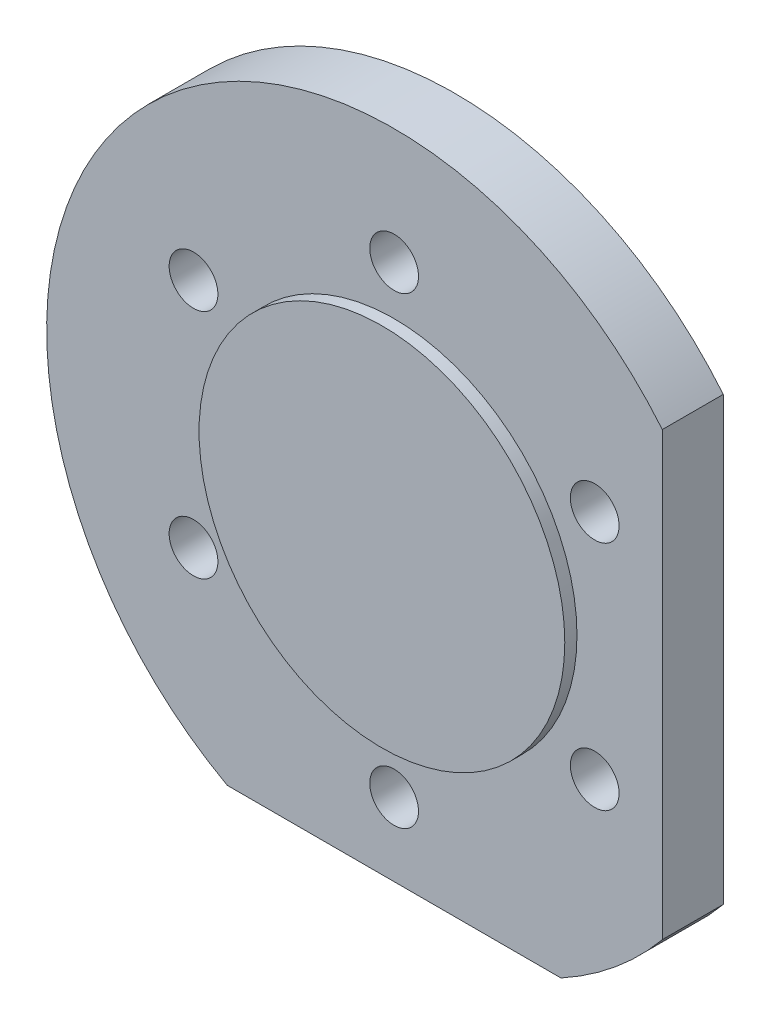
ISO-10303-21;
HEADER;
FILE_DESCRIPTION(('STEP AP214'),'2;1');
FILE_NAME('part.step','',(''),(''),'','','');
FILE_SCHEMA(('AUTOMOTIVE_DESIGN { 1 0 10303 214 1 1 1 1 }'));
ENDSEC;
DATA;
#1=APPLICATION_CONTEXT('core data for automotive mechanical design processes');
#2=APPLICATION_PROTOCOL_DEFINITION('international standard','automotive_design',2000,#1);
#3=PRODUCT_CONTEXT('',#1,'mechanical');
#4=PRODUCT('Part','Part','',(#3));
#5=PRODUCT_RELATED_PRODUCT_CATEGORY('part','',(#4));
#6=PRODUCT_DEFINITION_FORMATION('','',#4);
#7=PRODUCT_DEFINITION_CONTEXT('part definition',#1,'design');
#8=PRODUCT_DEFINITION('design','',#6,#7);
#9=PRODUCT_DEFINITION_SHAPE('','',#8);
#10=(LENGTH_UNIT() NAMED_UNIT(*) SI_UNIT(.MILLI.,.METRE.));
#11=(NAMED_UNIT(*) PLANE_ANGLE_UNIT() SI_UNIT($,.RADIAN.));
#12=(NAMED_UNIT(*) SI_UNIT($,.STERADIAN.) SOLID_ANGLE_UNIT());
#13=UNCERTAINTY_MEASURE_WITH_UNIT(LENGTH_MEASURE(1.E-05),#10,'distance_accuracy_value','');
#14=(GEOMETRIC_REPRESENTATION_CONTEXT(3) GLOBAL_UNCERTAINTY_ASSIGNED_CONTEXT((#13)) GLOBAL_UNIT_ASSIGNED_CONTEXT((#10,
#11,#12)) REPRESENTATION_CONTEXT('',''));
#15=CARTESIAN_POINT('',(0.,0.,0.));
#16=DIRECTION('',(0.,0.,1.));
#17=DIRECTION('',(1.,0.,0.));
#18=AXIS2_PLACEMENT_3D('',#15,#16,#17);
#19=CARTESIAN_POINT('',(0.,0.,5.));
#20=DIRECTION('',(0.,0.,1.));
#21=DIRECTION('',(1.,0.,0.));
#22=AXIS2_PLACEMENT_3D('',#19,#20,#21);
#23=PLANE('',#22);
#24=CARTESIAN_POINT('',(-16.4544826719043,-9.50000000000001,5.));
#25=DIRECTION('',(0.,0.,1.));
#26=DIRECTION('',(1.,0.,0.));
#27=AXIS2_PLACEMENT_3D('',#24,#25,#26);
#28=CIRCLE('',#27,2.);
#29=CARTESIAN_POINT('',(-14.4544826719043,-9.50000000000001,5.));
#30=VERTEX_POINT('',#29);
#31=EDGE_CURVE('E141',#30,#30,#28,.T.);
#32=ORIENTED_EDGE('',*,*,#31,.F.);
#33=EDGE_LOOP('',(#32));
#34=FACE_BOUND('',#33,.T.);
#35=CARTESIAN_POINT('',(16.4544826719043,-9.5,5.));
#36=DIRECTION('',(0.,0.,1.));
#37=DIRECTION('',(1.,0.,0.));
#38=AXIS2_PLACEMENT_3D('',#35,#36,#37);
#39=CIRCLE('',#38,2.);
#40=CARTESIAN_POINT('',(18.4544826719043,-9.5,5.));
#41=VERTEX_POINT('',#40);
#42=EDGE_CURVE('E153',#41,#41,#39,.T.);
#43=ORIENTED_EDGE('',*,*,#42,.F.);
#44=EDGE_LOOP('',(#43));
#45=FACE_BOUND('',#44,.T.);
#46=CARTESIAN_POINT('',(0.,19.,5.));
#47=DIRECTION('',(0.,0.,1.));
#48=DIRECTION('',(1.,0.,0.));
#49=AXIS2_PLACEMENT_3D('',#46,#47,#48);
#50=CIRCLE('',#49,2.);
#51=CARTESIAN_POINT('',(2.,19.,5.));
#52=VERTEX_POINT('',#51);
#53=EDGE_CURVE('E165',#52,#52,#50,.T.);
#54=ORIENTED_EDGE('',*,*,#53,.F.);
#55=EDGE_LOOP('',(#54));
#56=FACE_BOUND('',#55,.T.);
#57=CARTESIAN_POINT('',(0.,0.,5.));
#58=DIRECTION('',(0.,0.,1.));
#59=DIRECTION('',(1.,0.,0.));
#60=AXIS2_PLACEMENT_3D('',#57,#58,#59);
#61=CIRCLE('',#60,28.5);
#62=CARTESIAN_POINT('',(22.,18.1176709319934,5.));
#63=VERTEX_POINT('',#62);
#64=CARTESIAN_POINT('',(-13.683932183404,-25.,5.));
#65=VERTEX_POINT('',#64);
#66=EDGE_CURVE('E93',#63,#65,#61,.T.);
#67=ORIENTED_EDGE('',*,*,#66,.T.);
#68=DIRECTION('',(1.,0.,0.));
#69=VECTOR('',#68,1.);
#70=CARTESIAN_POINT('',(-13.683932183404,-25.,5.));
#71=LINE('',#70,#69);
#72=CARTESIAN_POINT('',(13.683932183404,-25.,5.));
#73=VERTEX_POINT('',#72);
#74=EDGE_CURVE('E88',#65,#73,#71,.T.);
#75=ORIENTED_EDGE('',*,*,#74,.T.);
#76=CARTESIAN_POINT('',(0.,0.,5.));
#77=DIRECTION('',(0.,0.,1.));
#78=DIRECTION('',(1.,0.,0.));
#79=AXIS2_PLACEMENT_3D('',#76,#77,#78);
#80=CIRCLE('',#79,28.5);
#81=CARTESIAN_POINT('',(22.,-18.1176709319935,5.));
#82=VERTEX_POINT('',#81);
#83=EDGE_CURVE('E91',#73,#82,#80,.T.);
#84=ORIENTED_EDGE('',*,*,#83,.T.);
#85=DIRECTION('',(0.,1.,0.));
#86=VECTOR('',#85,1.);
#87=CARTESIAN_POINT('',(22.,-18.1176709319934,5.));
#88=LINE('',#87,#86);
#89=EDGE_CURVE('E58',#82,#63,#88,.T.);
#90=ORIENTED_EDGE('',*,*,#89,.T.);
#91=EDGE_LOOP('',(#67,#75,#84,#90));
#92=FACE_BOUND('',#91,.T.);
#93=CARTESIAN_POINT('',(0.,0.,5.));
#94=DIRECTION('',(0.,0.,1.));
#95=DIRECTION('',(1.,0.,0.));
#96=AXIS2_PLACEMENT_3D('',#93,#94,#95);
#97=CIRCLE('',#96,15.);
#98=CARTESIAN_POINT('',(15.,0.,5.));
#99=VERTEX_POINT('',#98);
#100=EDGE_CURVE('E109',#99,#99,#97,.T.);
#101=ORIENTED_EDGE('',*,*,#100,.F.);
#102=EDGE_LOOP('',(#101));
#103=FACE_BOUND('',#102,.T.);
#104=CARTESIAN_POINT('',(16.4544826719043,9.50000000000001,5.));
#105=DIRECTION('',(0.,0.,1.));
#106=DIRECTION('',(1.,0.,0.));
#107=AXIS2_PLACEMENT_3D('',#104,#105,#106);
#108=CIRCLE('',#107,2.);
#109=CARTESIAN_POINT('',(18.4544826719043,9.50000000000001,5.));
#110=VERTEX_POINT('',#109);
#111=EDGE_CURVE('E159',#110,#110,#108,.T.);
#112=ORIENTED_EDGE('',*,*,#111,.F.);
#113=EDGE_LOOP('',(#112));
#114=FACE_BOUND('',#113,.T.);
#115=CARTESIAN_POINT('',(0.,-19.,5.));
#116=DIRECTION('',(0.,0.,1.));
#117=DIRECTION('',(1.,0.,0.));
#118=AXIS2_PLACEMENT_3D('',#115,#116,#117);
#119=CIRCLE('',#118,2.);
#120=CARTESIAN_POINT('',(2.,-19.,5.));
#121=VERTEX_POINT('',#120);
#122=EDGE_CURVE('E147',#121,#121,#119,.T.);
#123=ORIENTED_EDGE('',*,*,#122,.F.);
#124=EDGE_LOOP('',(#123));
#125=FACE_BOUND('',#124,.T.);
#126=CARTESIAN_POINT('',(-16.4544826719043,9.49999999999999,5.));
#127=DIRECTION('',(0.,0.,1.));
#128=DIRECTION('',(1.,0.,0.));
#129=AXIS2_PLACEMENT_3D('',#126,#127,#128);
#130=CIRCLE('',#129,2.);
#131=CARTESIAN_POINT('',(-14.4544826719043,9.49999999999999,5.));
#132=VERTEX_POINT('',#131);
#133=EDGE_CURVE('E135',#132,#132,#130,.T.);
#134=ORIENTED_EDGE('',*,*,#133,.F.);
#135=EDGE_LOOP('',(#134));
#136=FACE_BOUND('',#135,.T.);
#137=ADVANCED_FACE('F37',(#34,#45,#56,#92,#103,#114,#125,#136),#23,.T.);
#138=CARTESIAN_POINT('',(0.,0.,0.));
#139=DIRECTION('',(0.,0.,1.));
#140=DIRECTION('',(1.,0.,0.));
#141=AXIS2_PLACEMENT_3D('',#138,#139,#140);
#142=PLANE('',#141);
#143=CARTESIAN_POINT('',(0.,0.,0.));
#144=DIRECTION('',(0.,0.,1.));
#145=DIRECTION('',(1.,0.,0.));
#146=AXIS2_PLACEMENT_3D('',#143,#144,#145);
#147=CIRCLE('',#146,15.);
#148=CARTESIAN_POINT('',(15.,0.,0.));
#149=VERTEX_POINT('',#148);
#150=EDGE_CURVE('E117',#149,#149,#147,.T.);
#151=ORIENTED_EDGE('',*,*,#150,.T.);
#152=EDGE_LOOP('',(#151));
#153=FACE_BOUND('',#152,.T.);
#154=CARTESIAN_POINT('',(0.,0.,0.));
#155=DIRECTION('',(0.,0.,1.));
#156=DIRECTION('',(1.,0.,0.));
#157=AXIS2_PLACEMENT_3D('',#154,#155,#156);
#158=CIRCLE('',#157,28.5);
#159=CARTESIAN_POINT('',(22.,18.1176709319934,0.));
#160=VERTEX_POINT('',#159);
#161=CARTESIAN_POINT('',(-13.683932183404,-25.,0.));
#162=VERTEX_POINT('',#161);
#163=EDGE_CURVE('E106',#160,#162,#158,.T.);
#164=ORIENTED_EDGE('',*,*,#163,.F.);
#165=DIRECTION('',(0.,1.,0.));
#166=VECTOR('',#165,1.);
#167=CARTESIAN_POINT('',(22.,-18.1176709319934,0.));
#168=LINE('',#167,#166);
#169=CARTESIAN_POINT('',(22.,-18.1176709319935,0.));
#170=VERTEX_POINT('',#169);
#171=EDGE_CURVE('E81',#170,#160,#168,.T.);
#172=ORIENTED_EDGE('',*,*,#171,.F.);
#173=CARTESIAN_POINT('',(0.,0.,0.));
#174=DIRECTION('',(0.,0.,1.));
#175=DIRECTION('',(1.,0.,0.));
#176=AXIS2_PLACEMENT_3D('',#173,#174,#175);
#177=CIRCLE('',#176,28.5);
#178=CARTESIAN_POINT('',(13.683932183404,-25.,0.));
#179=VERTEX_POINT('',#178);
#180=EDGE_CURVE('E75',#179,#170,#177,.T.);
#181=ORIENTED_EDGE('',*,*,#180,.F.);
#182=DIRECTION('',(1.,0.,0.));
#183=VECTOR('',#182,1.);
#184=CARTESIAN_POINT('',(-13.683932183404,-25.,0.));
#185=LINE('',#184,#183);
#186=EDGE_CURVE('E97',#162,#179,#185,.T.);
#187=ORIENTED_EDGE('',*,*,#186,.F.);
#188=EDGE_LOOP('',(#164,#172,#181,#187));
#189=FACE_BOUND('',#188,.T.);
#190=CARTESIAN_POINT('',(0.,19.,0.));
#191=DIRECTION('',(0.,0.,1.));
#192=DIRECTION('',(1.,0.,0.));
#193=AXIS2_PLACEMENT_3D('',#190,#191,#192);
#194=CIRCLE('',#193,2.);
#195=CARTESIAN_POINT('',(2.,19.,0.));
#196=VERTEX_POINT('',#195);
#197=EDGE_CURVE('E162',#196,#196,#194,.T.);
#198=ORIENTED_EDGE('',*,*,#197,.T.);
#199=EDGE_LOOP('',(#198));
#200=FACE_BOUND('',#199,.T.);
#201=CARTESIAN_POINT('',(16.4544826719043,9.50000000000001,0.));
#202=DIRECTION('',(0.,0.,1.));
#203=DIRECTION('',(1.,0.,0.));
#204=AXIS2_PLACEMENT_3D('',#201,#202,#203);
#205=CIRCLE('',#204,2.);
#206=CARTESIAN_POINT('',(18.4544826719043,9.50000000000001,0.));
#207=VERTEX_POINT('',#206);
#208=EDGE_CURVE('E156',#207,#207,#205,.T.);
#209=ORIENTED_EDGE('',*,*,#208,.T.);
#210=EDGE_LOOP('',(#209));
#211=FACE_BOUND('',#210,.T.);
#212=CARTESIAN_POINT('',(16.4544826719043,-9.5,0.));
#213=DIRECTION('',(0.,0.,1.));
#214=DIRECTION('',(1.,0.,0.));
#215=AXIS2_PLACEMENT_3D('',#212,#213,#214);
#216=CIRCLE('',#215,2.);
#217=CARTESIAN_POINT('',(18.4544826719043,-9.5,0.));
#218=VERTEX_POINT('',#217);
#219=EDGE_CURVE('E150',#218,#218,#216,.T.);
#220=ORIENTED_EDGE('',*,*,#219,.T.);
#221=EDGE_LOOP('',(#220));
#222=FACE_BOUND('',#221,.T.);
#223=CARTESIAN_POINT('',(0.,-19.,0.));
#224=DIRECTION('',(0.,0.,1.));
#225=DIRECTION('',(1.,0.,0.));
#226=AXIS2_PLACEMENT_3D('',#223,#224,#225);
#227=CIRCLE('',#226,2.);
#228=CARTESIAN_POINT('',(2.,-19.,0.));
#229=VERTEX_POINT('',#228);
#230=EDGE_CURVE('E144',#229,#229,#227,.T.);
#231=ORIENTED_EDGE('',*,*,#230,.T.);
#232=EDGE_LOOP('',(#231));
#233=FACE_BOUND('',#232,.T.);
#234=CARTESIAN_POINT('',(-16.4544826719043,-9.50000000000001,0.));
#235=DIRECTION('',(0.,0.,1.));
#236=DIRECTION('',(1.,0.,0.));
#237=AXIS2_PLACEMENT_3D('',#234,#235,#236);
#238=CIRCLE('',#237,2.);
#239=CARTESIAN_POINT('',(-14.4544826719043,-9.50000000000001,0.));
#240=VERTEX_POINT('',#239);
#241=EDGE_CURVE('E138',#240,#240,#238,.T.);
#242=ORIENTED_EDGE('',*,*,#241,.T.);
#243=EDGE_LOOP('',(#242));
#244=FACE_BOUND('',#243,.T.);
#245=CARTESIAN_POINT('',(-16.4544826719043,9.49999999999999,0.));
#246=DIRECTION('',(0.,0.,1.));
#247=DIRECTION('',(1.,0.,0.));
#248=AXIS2_PLACEMENT_3D('',#245,#246,#247);
#249=CIRCLE('',#248,2.);
#250=CARTESIAN_POINT('',(-14.4544826719043,9.49999999999999,0.));
#251=VERTEX_POINT('',#250);
#252=EDGE_CURVE('E126',#251,#251,#249,.T.);
#253=ORIENTED_EDGE('',*,*,#252,.T.);
#254=EDGE_LOOP('',(#253));
#255=FACE_BOUND('',#254,.T.);
#256=ADVANCED_FACE('F118',(#153,#189,#200,#211,#222,#233,#244,#255),#142,.F.);
#257=CARTESIAN_POINT('',(0.,0.,5.));
#258=DIRECTION('',(0.,0.,-1.));
#259=DIRECTION('',(-1.,0.,0.));
#260=AXIS2_PLACEMENT_3D('',#257,#258,#259);
#261=CYLINDRICAL_SURFACE('',#260,28.5);
#262=ORIENTED_EDGE('',*,*,#163,.T.);
#263=DIRECTION('',(0.,0.,-1.));
#264=VECTOR('',#263,1.);
#265=CARTESIAN_POINT('',(-13.683932183404,-25.,5.));
#266=LINE('',#265,#264);
#267=EDGE_CURVE('E12',#65,#162,#266,.T.);
#268=ORIENTED_EDGE('',*,*,#267,.F.);
#269=ORIENTED_EDGE('',*,*,#66,.F.);
#270=DIRECTION('',(0.,0.,-1.));
#271=VECTOR('',#270,1.);
#272=CARTESIAN_POINT('',(22.,18.1176709319934,5.));
#273=LINE('',#272,#271);
#274=EDGE_CURVE('E102',#63,#160,#273,.T.);
#275=ORIENTED_EDGE('',*,*,#274,.T.);
#276=EDGE_LOOP('',(#262,#268,#269,#275));
#277=FACE_BOUND('',#276,.T.);
#278=ADVANCED_FACE('F39',(#277),#261,.T.);
#279=CARTESIAN_POINT('',(-13.683932183404,-25.,5.));
#280=DIRECTION('',(0.,1.,0.));
#281=DIRECTION('',(0.,0.,1.));
#282=AXIS2_PLACEMENT_3D('',#279,#280,#281);
#283=PLANE('',#282);
#284=ORIENTED_EDGE('',*,*,#186,.T.);
#285=DIRECTION('',(0.,0.,-1.));
#286=VECTOR('',#285,1.);
#287=CARTESIAN_POINT('',(13.683932183404,-25.,5.));
#288=LINE('',#287,#286);
#289=EDGE_CURVE('E49',#73,#179,#288,.T.);
#290=ORIENTED_EDGE('',*,*,#289,.F.);
#291=ORIENTED_EDGE('',*,*,#74,.F.);
#292=ORIENTED_EDGE('',*,*,#267,.T.);
#293=EDGE_LOOP('',(#284,#290,#291,#292));
#294=FACE_BOUND('',#293,.T.);
#295=ADVANCED_FACE('F96',(#294),#283,.F.);
#296=CARTESIAN_POINT('',(0.,0.,5.));
#297=DIRECTION('',(0.,0.,-1.));
#298=DIRECTION('',(-1.,0.,0.));
#299=AXIS2_PLACEMENT_3D('',#296,#297,#298);
#300=CYLINDRICAL_SURFACE('',#299,28.5);
#301=ORIENTED_EDGE('',*,*,#180,.T.);
#302=DIRECTION('',(0.,0.,-1.));
#303=VECTOR('',#302,1.);
#304=CARTESIAN_POINT('',(22.,-18.1176709319935,5.));
#305=LINE('',#304,#303);
#306=EDGE_CURVE('E98',#82,#170,#305,.T.);
#307=ORIENTED_EDGE('',*,*,#306,.F.);
#308=ORIENTED_EDGE('',*,*,#83,.F.);
#309=ORIENTED_EDGE('',*,*,#289,.T.);
#310=EDGE_LOOP('',(#301,#307,#308,#309));
#311=FACE_BOUND('',#310,.T.);
#312=ADVANCED_FACE('F100',(#311),#300,.T.);
#313=CARTESIAN_POINT('',(22.,-18.1176709319934,5.));
#314=DIRECTION('',(-1.,0.,0.));
#315=DIRECTION('',(0.,0.,1.));
#316=AXIS2_PLACEMENT_3D('',#313,#314,#315);
#317=PLANE('',#316);
#318=ORIENTED_EDGE('',*,*,#171,.T.);
#319=ORIENTED_EDGE('',*,*,#274,.F.);
#320=ORIENTED_EDGE('',*,*,#89,.F.);
#321=ORIENTED_EDGE('',*,*,#306,.T.);
#322=EDGE_LOOP('',(#318,#319,#320,#321));
#323=FACE_BOUND('',#322,.T.);
#324=ADVANCED_FACE('F200',(#323),#317,.F.);
#325=CARTESIAN_POINT('',(0.,19.,5.));
#326=DIRECTION('',(0.,0.,-1.));
#327=DIRECTION('',(-1.,0.,0.));
#328=AXIS2_PLACEMENT_3D('',#325,#326,#327);
#329=CYLINDRICAL_SURFACE('',#328,2.);
#330=ORIENTED_EDGE('',*,*,#53,.T.);
#331=EDGE_LOOP('',(#330));
#332=FACE_BOUND('',#331,.T.);
#333=ORIENTED_EDGE('',*,*,#197,.F.);
#334=EDGE_LOOP('',(#333));
#335=FACE_BOUND('',#334,.T.);
#336=ADVANCED_FACE('F203',(#332,#335),#329,.F.);
#337=CARTESIAN_POINT('',(16.4544826719043,9.50000000000001,5.));
#338=DIRECTION('',(0.,0.,-1.));
#339=DIRECTION('',(-1.,0.,0.));
#340=AXIS2_PLACEMENT_3D('',#337,#338,#339);
#341=CYLINDRICAL_SURFACE('',#340,2.);
#342=ORIENTED_EDGE('',*,*,#111,.T.);
#343=EDGE_LOOP('',(#342));
#344=FACE_BOUND('',#343,.T.);
#345=ORIENTED_EDGE('',*,*,#208,.F.);
#346=EDGE_LOOP('',(#345));
#347=FACE_BOUND('',#346,.T.);
#348=ADVANCED_FACE('F224',(#344,#347),#341,.F.);
#349=CARTESIAN_POINT('',(16.4544826719043,-9.5,5.));
#350=DIRECTION('',(0.,0.,-1.));
#351=DIRECTION('',(-1.,0.,0.));
#352=AXIS2_PLACEMENT_3D('',#349,#350,#351);
#353=CYLINDRICAL_SURFACE('',#352,2.);
#354=ORIENTED_EDGE('',*,*,#42,.T.);
#355=EDGE_LOOP('',(#354));
#356=FACE_BOUND('',#355,.T.);
#357=ORIENTED_EDGE('',*,*,#219,.F.);
#358=EDGE_LOOP('',(#357));
#359=FACE_BOUND('',#358,.T.);
#360=ADVANCED_FACE('F231',(#356,#359),#353,.F.);
#361=CARTESIAN_POINT('',(0.,-19.,5.));
#362=DIRECTION('',(0.,0.,-1.));
#363=DIRECTION('',(-1.,0.,0.));
#364=AXIS2_PLACEMENT_3D('',#361,#362,#363);
#365=CYLINDRICAL_SURFACE('',#364,2.);
#366=ORIENTED_EDGE('',*,*,#122,.T.);
#367=EDGE_LOOP('',(#366));
#368=FACE_BOUND('',#367,.T.);
#369=ORIENTED_EDGE('',*,*,#230,.F.);
#370=EDGE_LOOP('',(#369));
#371=FACE_BOUND('',#370,.T.);
#372=ADVANCED_FACE('F239',(#368,#371),#365,.F.);
#373=CARTESIAN_POINT('',(-16.4544826719043,-9.50000000000001,5.));
#374=DIRECTION('',(0.,0.,-1.));
#375=DIRECTION('',(-1.,0.,0.));
#376=AXIS2_PLACEMENT_3D('',#373,#374,#375);
#377=CYLINDRICAL_SURFACE('',#376,2.);
#378=ORIENTED_EDGE('',*,*,#31,.T.);
#379=EDGE_LOOP('',(#378));
#380=FACE_BOUND('',#379,.T.);
#381=ORIENTED_EDGE('',*,*,#241,.F.);
#382=EDGE_LOOP('',(#381));
#383=FACE_BOUND('',#382,.T.);
#384=ADVANCED_FACE('F188',(#380,#383),#377,.F.);
#385=CARTESIAN_POINT('',(-16.4544826719043,9.49999999999999,5.));
#386=DIRECTION('',(0.,0.,-1.));
#387=DIRECTION('',(-1.,0.,0.));
#388=AXIS2_PLACEMENT_3D('',#385,#386,#387);
#389=CYLINDRICAL_SURFACE('',#388,2.);
#390=ORIENTED_EDGE('',*,*,#133,.T.);
#391=EDGE_LOOP('',(#390));
#392=FACE_BOUND('',#391,.T.);
#393=ORIENTED_EDGE('',*,*,#252,.F.);
#394=EDGE_LOOP('',(#393));
#395=FACE_BOUND('',#394,.T.);
#396=ADVANCED_FACE('F185',(#392,#395),#389,.F.);
#397=CARTESIAN_POINT('',(0.,0.,6.));
#398=DIRECTION('',(0.,0.,-1.));
#399=DIRECTION('',(-1.,0.,0.));
#400=AXIS2_PLACEMENT_3D('',#397,#398,#399);
#401=CYLINDRICAL_SURFACE('',#400,15.);
#402=ORIENTED_EDGE('',*,*,#100,.T.);
#403=EDGE_LOOP('',(#402));
#404=FACE_BOUND('',#403,.T.);
#405=CARTESIAN_POINT('',(0.,0.,6.));
#406=DIRECTION('',(0.,0.,1.));
#407=DIRECTION('',(1.,0.,0.));
#408=AXIS2_PLACEMENT_3D('',#405,#406,#407);
#409=CIRCLE('',#408,15.);
#410=CARTESIAN_POINT('',(15.,0.,6.));
#411=VERTEX_POINT('',#410);
#412=EDGE_CURVE('E122',#411,#411,#409,.T.);
#413=ORIENTED_EDGE('',*,*,#412,.F.);
#414=EDGE_LOOP('',(#413));
#415=FACE_BOUND('',#414,.T.);
#416=ADVANCED_FACE('F173',(#404,#415),#401,.T.);
#417=CARTESIAN_POINT('',(0.,0.,6.));
#418=DIRECTION('',(0.,0.,1.));
#419=DIRECTION('',(1.,0.,0.));
#420=AXIS2_PLACEMENT_3D('',#417,#418,#419);
#421=PLANE('',#420);
#422=ORIENTED_EDGE('',*,*,#412,.T.);
#423=EDGE_LOOP('',(#422));
#424=FACE_BOUND('',#423,.T.);
#425=ADVANCED_FACE('F265',(#424),#421,.T.);
#426=CARTESIAN_POINT('',(0.,0.,-7.));
#427=DIRECTION('',(0.,0.,1.));
#428=DIRECTION('',(1.,0.,0.));
#429=AXIS2_PLACEMENT_3D('',#426,#427,#428);
#430=PLANE('',#429);
#431=CARTESIAN_POINT('',(0.,0.,-7.));
#432=DIRECTION('',(0.,0.,1.));
#433=DIRECTION('',(1.,0.,0.));
#434=AXIS2_PLACEMENT_3D('',#431,#432,#433);
#435=CIRCLE('',#434,12.);
#436=CARTESIAN_POINT('',(12.,0.,-7.));
#437=VERTEX_POINT('',#436);
#438=EDGE_CURVE('E123',#437,#437,#435,.T.);
#439=ORIENTED_EDGE('',*,*,#438,.F.);
#440=EDGE_LOOP('',(#439));
#441=FACE_BOUND('',#440,.T.);
#442=ADVANCED_FACE('F272',(#441),#430,.F.);
#443=CARTESIAN_POINT('',(0.,0.,-7.));
#444=DIRECTION('',(0.,0.,1.));
#445=DIRECTION('',(1.,0.,0.));
#446=AXIS2_PLACEMENT_3D('',#443,#444,#445);
#447=CONICAL_SURFACE('',#446,12.,0.404891786285083);
#448=ORIENTED_EDGE('',*,*,#438,.T.);
#449=EDGE_LOOP('',(#448));
#450=FACE_BOUND('',#449,.T.);
#451=ORIENTED_EDGE('',*,*,#150,.F.);
#452=EDGE_LOOP('',(#451));
#453=FACE_BOUND('',#452,.T.);
#454=ADVANCED_FACE('F280',(#450,#453),#447,.T.);
#455=CLOSED_SHELL('',(#137,#256,#278,#295,#312,#324,#336,#348,#360,#372,#384,#396,#416,#425,
#442,#454));
#456=MANIFOLD_SOLID_BREP('B2',#455);
#457=ADVANCED_BREP_SHAPE_REPRESENTATION('',(#18,#456),#14);
#458=SHAPE_DEFINITION_REPRESENTATION(#9,#457);
ENDSEC;
END-ISO-10303-21;
